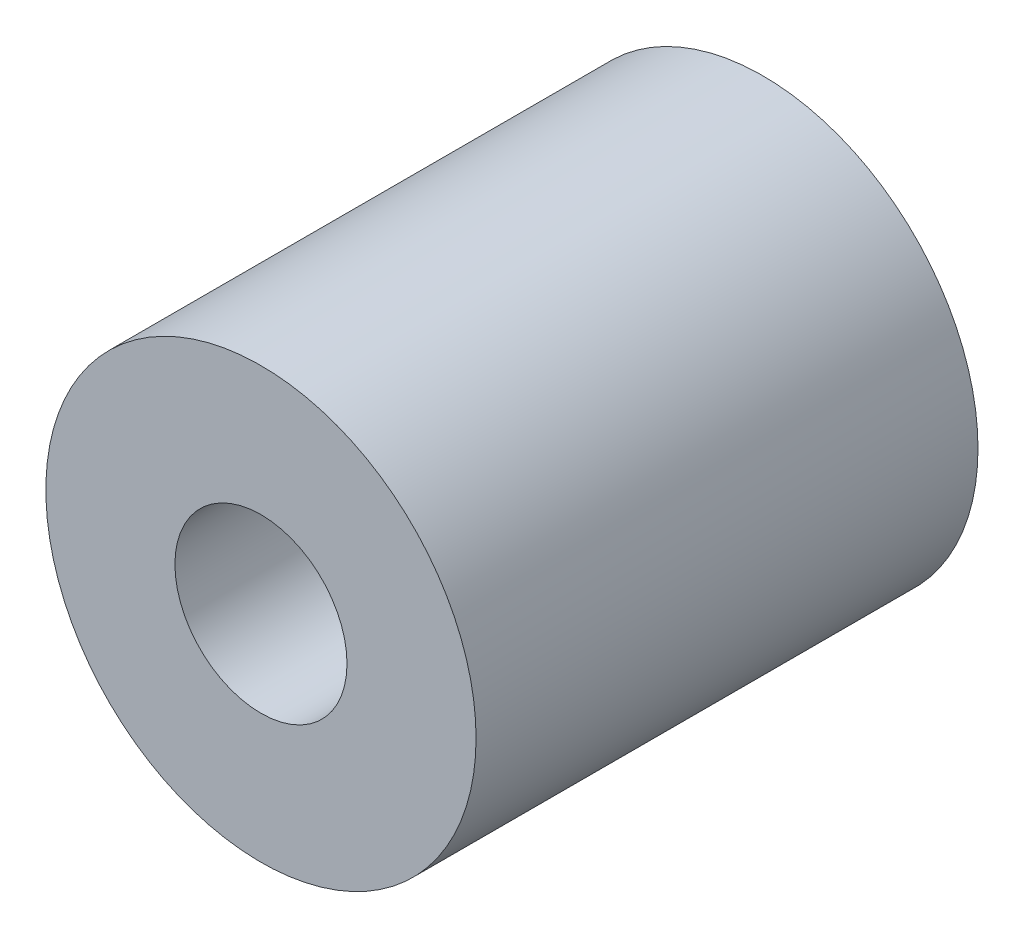
ISO-10303-21;
HEADER;
FILE_DESCRIPTION(('STEP AP214'),'2;1');
FILE_NAME('part.step','',(''),(''),'','','');
FILE_SCHEMA(('AUTOMOTIVE_DESIGN { 1 0 10303 214 1 1 1 1 }'));
ENDSEC;
DATA;
#1=APPLICATION_CONTEXT('core data for automotive mechanical design processes');
#2=APPLICATION_PROTOCOL_DEFINITION('international standard','automotive_design',2000,#1);
#3=PRODUCT_CONTEXT('',#1,'mechanical');
#4=PRODUCT('Part','Part','',(#3));
#5=PRODUCT_RELATED_PRODUCT_CATEGORY('part','',(#4));
#6=PRODUCT_DEFINITION_FORMATION('','',#4);
#7=PRODUCT_DEFINITION_CONTEXT('part definition',#1,'design');
#8=PRODUCT_DEFINITION('design','',#6,#7);
#9=PRODUCT_DEFINITION_SHAPE('','',#8);
#10=(LENGTH_UNIT() NAMED_UNIT(*) SI_UNIT(.MILLI.,.METRE.));
#11=(NAMED_UNIT(*) PLANE_ANGLE_UNIT() SI_UNIT($,.RADIAN.));
#12=(NAMED_UNIT(*) SI_UNIT($,.STERADIAN.) SOLID_ANGLE_UNIT());
#13=UNCERTAINTY_MEASURE_WITH_UNIT(LENGTH_MEASURE(1.E-05),#10,'distance_accuracy_value','');
#14=(GEOMETRIC_REPRESENTATION_CONTEXT(3) GLOBAL_UNCERTAINTY_ASSIGNED_CONTEXT((#13)) GLOBAL_UNIT_ASSIGNED_CONTEXT((#10,
#11,#12)) REPRESENTATION_CONTEXT('',''));
#15=CARTESIAN_POINT('',(0.,0.,0.));
#16=DIRECTION('',(0.,0.,1.));
#17=DIRECTION('',(1.,0.,0.));
#18=AXIS2_PLACEMENT_3D('',#15,#16,#17);
#19=CARTESIAN_POINT('',(0.,0.,35.));
#20=DIRECTION('',(0.,0.,-1.));
#21=DIRECTION('',(-1.,0.,0.));
#22=AXIS2_PLACEMENT_3D('',#19,#20,#21);
#23=CYLINDRICAL_SURFACE('',#22,15.);
#24=CARTESIAN_POINT('',(0.,0.,35.));
#25=DIRECTION('',(0.,0.,1.));
#26=DIRECTION('',(1.,0.,0.));
#27=AXIS2_PLACEMENT_3D('',#24,#25,#26);
#28=CIRCLE('',#27,15.);
#29=CARTESIAN_POINT('',(15.,0.,35.));
#30=VERTEX_POINT('',#29);
#31=EDGE_CURVE('E10',#30,#30,#28,.T.);
#32=ORIENTED_EDGE('',*,*,#31,.F.);
#33=EDGE_LOOP('',(#32));
#34=FACE_BOUND('',#33,.T.);
#35=CARTESIAN_POINT('',(0.,0.,0.));
#36=DIRECTION('',(0.,0.,1.));
#37=DIRECTION('',(1.,0.,0.));
#38=AXIS2_PLACEMENT_3D('',#35,#36,#37);
#39=CIRCLE('',#38,15.);
#40=CARTESIAN_POINT('',(15.,0.,0.));
#41=VERTEX_POINT('',#40);
#42=EDGE_CURVE('E37',#41,#41,#39,.T.);
#43=ORIENTED_EDGE('',*,*,#42,.T.);
#44=EDGE_LOOP('',(#43));
#45=FACE_BOUND('',#44,.T.);
#46=ADVANCED_FACE('F34',(#34,#45),#23,.T.);
#47=CARTESIAN_POINT('',(0.,0.,35.));
#48=DIRECTION('',(0.,0.,1.));
#49=DIRECTION('',(1.,0.,0.));
#50=AXIS2_PLACEMENT_3D('',#47,#48,#49);
#51=PLANE('',#50);
#52=CARTESIAN_POINT('',(0.,0.,35.));
#53=DIRECTION('',(0.,0.,1.));
#54=DIRECTION('',(1.,0.,0.));
#55=AXIS2_PLACEMENT_3D('',#52,#53,#54);
#56=CIRCLE('',#55,6.);
#57=CARTESIAN_POINT('',(6.,0.,35.));
#58=VERTEX_POINT('',#57);
#59=EDGE_CURVE('E46',#58,#58,#56,.T.);
#60=ORIENTED_EDGE('',*,*,#59,.F.);
#61=EDGE_LOOP('',(#60));
#62=FACE_BOUND('',#61,.T.);
#63=ORIENTED_EDGE('',*,*,#31,.T.);
#64=EDGE_LOOP('',(#63));
#65=FACE_BOUND('',#64,.T.);
#66=ADVANCED_FACE('F71',(#62,#65),#51,.T.);
#67=CARTESIAN_POINT('',(0.,0.,0.));
#68=DIRECTION('',(0.,0.,1.));
#69=DIRECTION('',(1.,0.,0.));
#70=AXIS2_PLACEMENT_3D('',#67,#68,#69);
#71=PLANE('',#70);
#72=CARTESIAN_POINT('',(0.,0.,0.));
#73=DIRECTION('',(0.,0.,-1.));
#74=DIRECTION('',(-1.,0.,0.));
#75=AXIS2_PLACEMENT_3D('',#72,#73,#74);
#76=CIRCLE('',#75,5.);
#77=CARTESIAN_POINT('',(-5.,0.,0.));
#78=VERTEX_POINT('',#77);
#79=EDGE_CURVE('E52',#78,#78,#76,.T.);
#80=ORIENTED_EDGE('',*,*,#79,.F.);
#81=EDGE_LOOP('',(#80));
#82=FACE_BOUND('',#81,.T.);
#83=ORIENTED_EDGE('',*,*,#42,.F.);
#84=EDGE_LOOP('',(#83));
#85=FACE_BOUND('',#84,.T.);
#86=ADVANCED_FACE('F67',(#82,#85),#71,.F.);
#87=CARTESIAN_POINT('',(0.,0.,23.5));
#88=DIRECTION('',(0.,0.,1.));
#89=DIRECTION('',(1.,0.,0.));
#90=AXIS2_PLACEMENT_3D('',#87,#88,#89);
#91=CYLINDRICAL_SURFACE('',#90,6.);
#92=CARTESIAN_POINT('',(0.,0.,23.5));
#93=DIRECTION('',(0.,0.,1.));
#94=DIRECTION('',(1.,0.,0.));
#95=AXIS2_PLACEMENT_3D('',#92,#93,#94);
#96=CIRCLE('',#95,6.);
#97=CARTESIAN_POINT('',(6.,0.,23.5));
#98=VERTEX_POINT('',#97);
#99=EDGE_CURVE('E44',#98,#98,#96,.T.);
#100=ORIENTED_EDGE('',*,*,#99,.F.);
#101=EDGE_LOOP('',(#100));
#102=FACE_BOUND('',#101,.T.);
#103=ORIENTED_EDGE('',*,*,#59,.T.);
#104=EDGE_LOOP('',(#103));
#105=FACE_BOUND('',#104,.T.);
#106=ADVANCED_FACE('F70',(#102,#105),#91,.F.);
#107=CARTESIAN_POINT('',(0.,0.,23.5));
#108=DIRECTION('',(0.,0.,1.));
#109=DIRECTION('',(1.,0.,0.));
#110=AXIS2_PLACEMENT_3D('',#107,#108,#109);
#111=PLANE('',#110);
#112=ORIENTED_EDGE('',*,*,#99,.T.);
#113=EDGE_LOOP('',(#112));
#114=FACE_BOUND('',#113,.T.);
#115=ADVANCED_FACE('F63',(#114),#111,.T.);
#116=CARTESIAN_POINT('',(0.,0.,11.5));
#117=DIRECTION('',(0.,0.,-1.));
#118=DIRECTION('',(-1.,0.,0.));
#119=AXIS2_PLACEMENT_3D('',#116,#117,#118);
#120=CYLINDRICAL_SURFACE('',#119,5.);
#121=CARTESIAN_POINT('',(0.,0.,11.5));
#122=DIRECTION('',(0.,0.,-1.));
#123=DIRECTION('',(-1.,0.,0.));
#124=AXIS2_PLACEMENT_3D('',#121,#122,#123);
#125=CIRCLE('',#124,5.);
#126=CARTESIAN_POINT('',(-5.,0.,11.5));
#127=VERTEX_POINT('',#126);
#128=EDGE_CURVE('E49',#127,#127,#125,.T.);
#129=ORIENTED_EDGE('',*,*,#128,.F.);
#130=EDGE_LOOP('',(#129));
#131=FACE_BOUND('',#130,.T.);
#132=ORIENTED_EDGE('',*,*,#79,.T.);
#133=EDGE_LOOP('',(#132));
#134=FACE_BOUND('',#133,.T.);
#135=ADVANCED_FACE('F60',(#131,#134),#120,.F.);
#136=CARTESIAN_POINT('',(0.,0.,11.5));
#137=DIRECTION('',(0.,0.,-1.));
#138=DIRECTION('',(-1.,0.,0.));
#139=AXIS2_PLACEMENT_3D('',#136,#137,#138);
#140=PLANE('',#139);
#141=ORIENTED_EDGE('',*,*,#128,.T.);
#142=EDGE_LOOP('',(#141));
#143=FACE_BOUND('',#142,.T.);
#144=ADVANCED_FACE('F58',(#143),#140,.T.);
#145=CLOSED_SHELL('',(#46,#66,#86,#106,#115,#135,#144));
#146=MANIFOLD_SOLID_BREP('B2',#145);
#147=ADVANCED_BREP_SHAPE_REPRESENTATION('',(#18,#146),#14);
#148=SHAPE_DEFINITION_REPRESENTATION(#9,#147);
ENDSEC;
END-ISO-10303-21;
